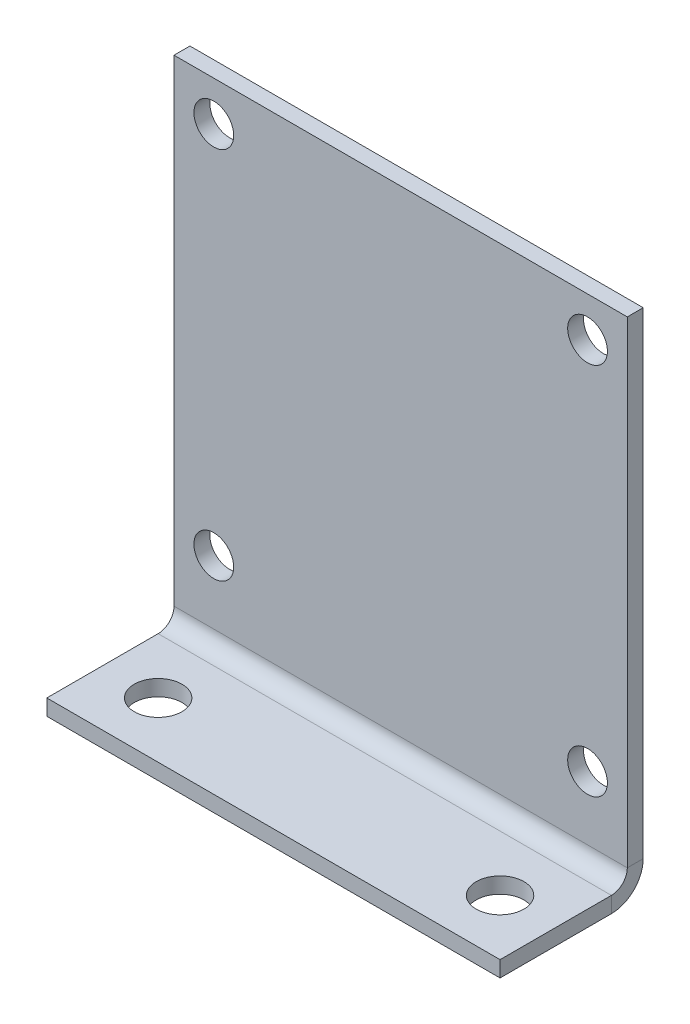
ISO-10303-21;
HEADER;
FILE_DESCRIPTION(('STEP AP214'),'2;1');
FILE_NAME('part.step','',(''),(''),'','','');
FILE_SCHEMA(('AUTOMOTIVE_DESIGN { 1 0 10303 214 1 1 1 1 }'));
ENDSEC;
DATA;
#1=APPLICATION_CONTEXT('core data for automotive mechanical design processes');
#2=APPLICATION_PROTOCOL_DEFINITION('international standard','automotive_design',2000,#1);
#3=PRODUCT_CONTEXT('',#1,'mechanical');
#4=PRODUCT('Part','Part','',(#3));
#5=PRODUCT_RELATED_PRODUCT_CATEGORY('part','',(#4));
#6=PRODUCT_DEFINITION_FORMATION('','',#4);
#7=PRODUCT_DEFINITION_CONTEXT('part definition',#1,'design');
#8=PRODUCT_DEFINITION('design','',#6,#7);
#9=PRODUCT_DEFINITION_SHAPE('','',#8);
#10=(LENGTH_UNIT() NAMED_UNIT(*) SI_UNIT(.MILLI.,.METRE.));
#11=(NAMED_UNIT(*) PLANE_ANGLE_UNIT() SI_UNIT($,.RADIAN.));
#12=(NAMED_UNIT(*) SI_UNIT($,.STERADIAN.) SOLID_ANGLE_UNIT());
#13=UNCERTAINTY_MEASURE_WITH_UNIT(LENGTH_MEASURE(1.E-05),#10,'distance_accuracy_value','');
#14=(GEOMETRIC_REPRESENTATION_CONTEXT(3) GLOBAL_UNCERTAINTY_ASSIGNED_CONTEXT((#13)) GLOBAL_UNIT_ASSIGNED_CONTEXT((#10,
#11,#12)) REPRESENTATION_CONTEXT('',''));
#15=CARTESIAN_POINT('',(0.,0.,0.));
#16=DIRECTION('',(0.,0.,1.));
#17=DIRECTION('',(1.,0.,0.));
#18=AXIS2_PLACEMENT_3D('',#15,#16,#17);
#19=CARTESIAN_POINT('',(50.,2.,11.));
#20=DIRECTION('',(0.,-1.,0.));
#21=DIRECTION('',(-1.,0.,0.));
#22=AXIS2_PLACEMENT_3D('',#19,#20,#21);
#23=CYLINDRICAL_SURFACE('',#22,3.);
#24=CARTESIAN_POINT('',(50.,2.,11.));
#25=DIRECTION('',(0.,-1.,0.));
#26=DIRECTION('',(-1.,0.,0.));
#27=AXIS2_PLACEMENT_3D('',#24,#25,#26);
#28=CIRCLE('',#27,3.);
#29=CARTESIAN_POINT('',(53.,2.,11.));
#30=VERTEX_POINT('',#29);
#31=EDGE_CURVE('E41',#30,#30,#28,.T.);
#32=ORIENTED_EDGE('',*,*,#31,.F.);
#33=DIRECTION('',(0.,-1.,0.));
#34=VECTOR('',#33,1.);
#35=CARTESIAN_POINT('',(53.,2.,11.));
#36=LINE('',#35,#34);
#37=CARTESIAN_POINT('',(53.,0.,11.));
#38=VERTEX_POINT('',#37);
#39=EDGE_CURVE('E11',#30,#38,#36,.T.);
#40=ORIENTED_EDGE('',*,*,#39,.T.);
#41=CARTESIAN_POINT('',(50.,0.,11.));
#42=DIRECTION('',(0.,1.,0.));
#43=DIRECTION('',(-1.,0.,0.));
#44=AXIS2_PLACEMENT_3D('',#41,#42,#43);
#45=CIRCLE('',#44,3.);
#46=EDGE_CURVE('E209',#38,#38,#45,.T.);
#47=ORIENTED_EDGE('',*,*,#46,.F.);
#48=ORIENTED_EDGE('',*,*,#39,.F.);
#49=EDGE_LOOP('',(#32,#40,#47,#48));
#50=FACE_BOUND('',#49,.T.);
#51=ADVANCED_FACE('F17',(#50),#23,.F.);
#52=CARTESIAN_POINT('',(7.,2.,11.));
#53=DIRECTION('',(0.,-1.,0.));
#54=DIRECTION('',(-1.,0.,0.));
#55=AXIS2_PLACEMENT_3D('',#52,#53,#54);
#56=CYLINDRICAL_SURFACE('',#55,3.);
#57=CARTESIAN_POINT('',(7.,2.,11.));
#58=DIRECTION('',(0.,-1.,0.));
#59=DIRECTION('',(-1.,0.,0.));
#60=AXIS2_PLACEMENT_3D('',#57,#58,#59);
#61=CIRCLE('',#60,3.);
#62=CARTESIAN_POINT('',(10.,2.,11.));
#63=VERTEX_POINT('',#62);
#64=EDGE_CURVE('E274',#63,#63,#61,.T.);
#65=ORIENTED_EDGE('',*,*,#64,.F.);
#66=DIRECTION('',(0.,-1.,0.));
#67=VECTOR('',#66,1.);
#68=CARTESIAN_POINT('',(10.,2.,11.));
#69=LINE('',#68,#67);
#70=CARTESIAN_POINT('',(10.,0.,11.));
#71=VERTEX_POINT('',#70);
#72=EDGE_CURVE('E28',#63,#71,#69,.T.);
#73=ORIENTED_EDGE('',*,*,#72,.T.);
#74=CARTESIAN_POINT('',(7.,0.,11.));
#75=DIRECTION('',(0.,1.,0.));
#76=DIRECTION('',(-1.,0.,0.));
#77=AXIS2_PLACEMENT_3D('',#74,#75,#76);
#78=CIRCLE('',#77,3.);
#79=EDGE_CURVE('E214',#71,#71,#78,.T.);
#80=ORIENTED_EDGE('',*,*,#79,.F.);
#81=ORIENTED_EDGE('',*,*,#72,.F.);
#82=EDGE_LOOP('',(#65,#73,#80,#81));
#83=FACE_BOUND('',#82,.T.);
#84=ADVANCED_FACE('F382',(#83),#56,.F.);
#85=CARTESIAN_POINT('',(5.,12.,0.));
#86=DIRECTION('',(0.,0.,1.));
#87=DIRECTION('',(1.,0.,0.));
#88=AXIS2_PLACEMENT_3D('',#85,#86,#87);
#89=CYLINDRICAL_SURFACE('',#88,2.5);
#90=CARTESIAN_POINT('',(5.,12.,0.));
#91=DIRECTION('',(0.,0.,1.));
#92=DIRECTION('',(1.,0.,0.));
#93=AXIS2_PLACEMENT_3D('',#90,#91,#92);
#94=CIRCLE('',#93,2.5);
#95=CARTESIAN_POINT('',(2.5,12.,0.));
#96=VERTEX_POINT('',#95);
#97=EDGE_CURVE('E143',#96,#96,#94,.T.);
#98=ORIENTED_EDGE('',*,*,#97,.F.);
#99=DIRECTION('',(0.,0.,1.));
#100=VECTOR('',#99,1.);
#101=CARTESIAN_POINT('',(2.5,12.,0.));
#102=LINE('',#101,#100);
#103=CARTESIAN_POINT('',(2.5,12.,2.));
#104=VERTEX_POINT('',#103);
#105=EDGE_CURVE('E151',#96,#104,#102,.T.);
#106=ORIENTED_EDGE('',*,*,#105,.T.);
#107=CARTESIAN_POINT('',(5.,12.,2.));
#108=DIRECTION('',(0.,0.,-1.));
#109=DIRECTION('',(1.,0.,0.));
#110=AXIS2_PLACEMENT_3D('',#107,#108,#109);
#111=CIRCLE('',#110,2.5);
#112=EDGE_CURVE('E150',#104,#104,#111,.T.);
#113=ORIENTED_EDGE('',*,*,#112,.F.);
#114=ORIENTED_EDGE('',*,*,#105,.F.);
#115=EDGE_LOOP('',(#98,#106,#113,#114));
#116=FACE_BOUND('',#115,.T.);
#117=ADVANCED_FACE('F19',(#116),#89,.F.);
#118=CARTESIAN_POINT('',(5.,59.,0.));
#119=DIRECTION('',(0.,0.,1.));
#120=DIRECTION('',(1.,0.,0.));
#121=AXIS2_PLACEMENT_3D('',#118,#119,#120);
#122=CYLINDRICAL_SURFACE('',#121,2.5);
#123=CARTESIAN_POINT('',(5.,59.,0.));
#124=DIRECTION('',(0.,0.,1.));
#125=DIRECTION('',(1.,0.,0.));
#126=AXIS2_PLACEMENT_3D('',#123,#124,#125);
#127=CIRCLE('',#126,2.5);
#128=CARTESIAN_POINT('',(2.5,59.,0.));
#129=VERTEX_POINT('',#128);
#130=EDGE_CURVE('E229',#129,#129,#127,.T.);
#131=ORIENTED_EDGE('',*,*,#130,.F.);
#132=DIRECTION('',(0.,0.,1.));
#133=VECTOR('',#132,1.);
#134=CARTESIAN_POINT('',(2.5,59.,0.));
#135=LINE('',#134,#133);
#136=CARTESIAN_POINT('',(2.5,59.,2.));
#137=VERTEX_POINT('',#136);
#138=EDGE_CURVE('E179',#129,#137,#135,.T.);
#139=ORIENTED_EDGE('',*,*,#138,.T.);
#140=CARTESIAN_POINT('',(5.,59.,2.));
#141=DIRECTION('',(0.,0.,-1.));
#142=DIRECTION('',(1.,0.,0.));
#143=AXIS2_PLACEMENT_3D('',#140,#141,#142);
#144=CIRCLE('',#143,2.5);
#145=EDGE_CURVE('E154',#137,#137,#144,.T.);
#146=ORIENTED_EDGE('',*,*,#145,.F.);
#147=ORIENTED_EDGE('',*,*,#138,.F.);
#148=EDGE_LOOP('',(#131,#139,#146,#147));
#149=FACE_BOUND('',#148,.T.);
#150=ADVANCED_FACE('F357',(#149),#122,.F.);
#151=CARTESIAN_POINT('',(52.,59.,0.));
#152=DIRECTION('',(0.,0.,1.));
#153=DIRECTION('',(1.,0.,0.));
#154=AXIS2_PLACEMENT_3D('',#151,#152,#153);
#155=CYLINDRICAL_SURFACE('',#154,2.5);
#156=CARTESIAN_POINT('',(52.,59.,0.));
#157=DIRECTION('',(0.,0.,1.));
#158=DIRECTION('',(1.,0.,0.));
#159=AXIS2_PLACEMENT_3D('',#156,#157,#158);
#160=CIRCLE('',#159,2.5);
#161=CARTESIAN_POINT('',(49.5,59.,0.));
#162=VERTEX_POINT('',#161);
#163=EDGE_CURVE('E189',#162,#162,#160,.T.);
#164=ORIENTED_EDGE('',*,*,#163,.F.);
#165=DIRECTION('',(0.,0.,1.));
#166=VECTOR('',#165,1.);
#167=CARTESIAN_POINT('',(49.5,59.,0.));
#168=LINE('',#167,#166);
#169=CARTESIAN_POINT('',(49.5,59.,2.));
#170=VERTEX_POINT('',#169);
#171=EDGE_CURVE('E175',#162,#170,#168,.T.);
#172=ORIENTED_EDGE('',*,*,#171,.T.);
#173=CARTESIAN_POINT('',(52.,59.,2.));
#174=DIRECTION('',(0.,0.,-1.));
#175=DIRECTION('',(1.,0.,0.));
#176=AXIS2_PLACEMENT_3D('',#173,#174,#175);
#177=CIRCLE('',#176,2.5);
#178=EDGE_CURVE('E164',#170,#170,#177,.T.);
#179=ORIENTED_EDGE('',*,*,#178,.F.);
#180=ORIENTED_EDGE('',*,*,#171,.F.);
#181=EDGE_LOOP('',(#164,#172,#179,#180));
#182=FACE_BOUND('',#181,.T.);
#183=ADVANCED_FACE('F393',(#182),#155,.F.);
#184=CARTESIAN_POINT('',(52.,12.,0.));
#185=DIRECTION('',(0.,0.,1.));
#186=DIRECTION('',(1.,0.,0.));
#187=AXIS2_PLACEMENT_3D('',#184,#185,#186);
#188=CYLINDRICAL_SURFACE('',#187,2.5);
#189=CARTESIAN_POINT('',(52.,12.,0.));
#190=DIRECTION('',(0.,0.,1.));
#191=DIRECTION('',(1.,0.,0.));
#192=AXIS2_PLACEMENT_3D('',#189,#190,#191);
#193=CIRCLE('',#192,2.5);
#194=CARTESIAN_POINT('',(49.5,12.,0.));
#195=VERTEX_POINT('',#194);
#196=EDGE_CURVE('E185',#195,#195,#193,.T.);
#197=ORIENTED_EDGE('',*,*,#196,.F.);
#198=DIRECTION('',(0.,0.,1.));
#199=VECTOR('',#198,1.);
#200=CARTESIAN_POINT('',(49.5,12.,0.));
#201=LINE('',#200,#199);
#202=CARTESIAN_POINT('',(49.5,12.,2.));
#203=VERTEX_POINT('',#202);
#204=EDGE_CURVE('E180',#195,#203,#201,.T.);
#205=ORIENTED_EDGE('',*,*,#204,.T.);
#206=CARTESIAN_POINT('',(52.,12.,2.));
#207=DIRECTION('',(0.,0.,-1.));
#208=DIRECTION('',(1.,0.,0.));
#209=AXIS2_PLACEMENT_3D('',#206,#207,#208);
#210=CIRCLE('',#209,2.5);
#211=EDGE_CURVE('E184',#203,#203,#210,.T.);
#212=ORIENTED_EDGE('',*,*,#211,.F.);
#213=ORIENTED_EDGE('',*,*,#204,.F.);
#214=EDGE_LOOP('',(#197,#205,#212,#213));
#215=FACE_BOUND('',#214,.T.);
#216=ADVANCED_FACE('F367',(#215),#188,.F.);
#217=CARTESIAN_POINT('',(28.5,4.,4.));
#218=DIRECTION('',(-1.,0.,0.));
#219=DIRECTION('',(0.,0.,-1.));
#220=AXIS2_PLACEMENT_3D('',#217,#218,#219);
#221=CYLINDRICAL_SURFACE('',#220,4.);
#222=DIRECTION('',(1.,0.,0.));
#223=VECTOR('',#222,1.);
#224=CARTESIAN_POINT('',(28.5,0.,4.));
#225=LINE('',#224,#223);
#226=CARTESIAN_POINT('',(0.,0.,4.));
#227=VERTEX_POINT('',#226);
#228=CARTESIAN_POINT('',(57.,0.,4.));
#229=VERTEX_POINT('',#228);
#230=EDGE_CURVE('E213',#227,#229,#225,.T.);
#231=ORIENTED_EDGE('',*,*,#230,.F.);
#232=CARTESIAN_POINT('',(0.,4.,4.));
#233=DIRECTION('',(-1.,0.,0.));
#234=DIRECTION('',(0.,0.,-1.));
#235=AXIS2_PLACEMENT_3D('',#232,#233,#234);
#236=CIRCLE('',#235,4.);
#237=CARTESIAN_POINT('',(0.,4.,0.));
#238=VERTEX_POINT('',#237);
#239=EDGE_CURVE('E253',#238,#227,#236,.T.);
#240=ORIENTED_EDGE('',*,*,#239,.F.);
#241=DIRECTION('',(-1.,0.,0.));
#242=VECTOR('',#241,1.);
#243=CARTESIAN_POINT('',(42.75,4.,0.));
#244=LINE('',#243,#242);
#245=CARTESIAN_POINT('',(57.,4.,0.));
#246=VERTEX_POINT('',#245);
#247=EDGE_CURVE('E218',#246,#238,#244,.T.);
#248=ORIENTED_EDGE('',*,*,#247,.F.);
#249=CARTESIAN_POINT('',(57.,4.,4.));
#250=DIRECTION('',(1.,0.,0.));
#251=DIRECTION('',(0.,-1.,0.));
#252=AXIS2_PLACEMENT_3D('',#249,#250,#251);
#253=CIRCLE('',#252,4.);
#254=EDGE_CURVE('E236',#229,#246,#253,.T.);
#255=ORIENTED_EDGE('',*,*,#254,.F.);
#256=EDGE_LOOP('',(#231,#240,#248,#255));
#257=FACE_BOUND('',#256,.T.);
#258=ADVANCED_FACE('F392',(#257),#221,.T.);
#259=CARTESIAN_POINT('',(57.,2.,4.));
#260=DIRECTION('',(1.,0.,0.));
#261=DIRECTION('',(0.,1.,0.));
#262=AXIS2_PLACEMENT_3D('',#259,#260,#261);
#263=PLANE('',#262);
#264=DIRECTION('',(0.,1.,0.));
#265=VECTOR('',#264,1.);
#266=CARTESIAN_POINT('',(57.,1.56,4.));
#267=LINE('',#266,#265);
#268=CARTESIAN_POINT('',(57.,2.,4.));
#269=VERTEX_POINT('',#268);
#270=EDGE_CURVE('E205',#229,#269,#267,.T.);
#271=ORIENTED_EDGE('',*,*,#270,.T.);
#272=DIRECTION('',(0.,0.,1.));
#273=VECTOR('',#272,1.);
#274=CARTESIAN_POINT('',(57.,2.,-0.523893421169303));
#275=LINE('',#274,#273);
#276=CARTESIAN_POINT('',(57.,2.,18.));
#277=VERTEX_POINT('',#276);
#278=EDGE_CURVE('E172',#269,#277,#275,.T.);
#279=ORIENTED_EDGE('',*,*,#278,.T.);
#280=DIRECTION('',(0.,-1.,0.));
#281=VECTOR('',#280,1.);
#282=CARTESIAN_POINT('',(57.,2.,18.));
#283=LINE('',#282,#281);
#284=CARTESIAN_POINT('',(57.,0.,18.));
#285=VERTEX_POINT('',#284);
#286=EDGE_CURVE('E170',#277,#285,#283,.T.);
#287=ORIENTED_EDGE('',*,*,#286,.T.);
#288=DIRECTION('',(0.,0.,-1.));
#289=VECTOR('',#288,1.);
#290=CARTESIAN_POINT('',(57.,0.,-0.523893421169303));
#291=LINE('',#290,#289);
#292=EDGE_CURVE('E173',#285,#229,#291,.T.);
#293=ORIENTED_EDGE('',*,*,#292,.T.);
#294=EDGE_LOOP('',(#271,#279,#287,#293));
#295=FACE_BOUND('',#294,.T.);
#296=ADVANCED_FACE('F389',(#295),#263,.T.);
#297=CARTESIAN_POINT('',(28.5,2.,8.73805328941535));
#298=DIRECTION('',(0.,1.,0.));
#299=DIRECTION('',(1.,0.,0.));
#300=AXIS2_PLACEMENT_3D('',#297,#298,#299);
#301=PLANE('',#300);
#302=DIRECTION('',(-1.,0.,0.));
#303=VECTOR('',#302,1.);
#304=CARTESIAN_POINT('',(28.5,2.,4.));
#305=LINE('',#304,#303);
#306=CARTESIAN_POINT('',(0.,2.,4.));
#307=VERTEX_POINT('',#306);
#308=EDGE_CURVE('E197',#269,#307,#305,.T.);
#309=ORIENTED_EDGE('',*,*,#308,.T.);
#310=DIRECTION('',(0.,0.,1.));
#311=VECTOR('',#310,1.);
#312=CARTESIAN_POINT('',(0.,2.,-0.523893421169303));
#313=LINE('',#312,#311);
#314=CARTESIAN_POINT('',(0.,2.,18.));
#315=VERTEX_POINT('',#314);
#316=EDGE_CURVE('E198',#307,#315,#313,.T.);
#317=ORIENTED_EDGE('',*,*,#316,.T.);
#318=DIRECTION('',(1.,0.,0.));
#319=VECTOR('',#318,1.);
#320=CARTESIAN_POINT('',(0.,2.,18.));
#321=LINE('',#320,#319);
#322=EDGE_CURVE('E21',#315,#277,#321,.T.);
#323=ORIENTED_EDGE('',*,*,#322,.T.);
#324=ORIENTED_EDGE('',*,*,#278,.F.);
#325=EDGE_LOOP('',(#309,#317,#323,#324));
#326=FACE_BOUND('',#325,.T.);
#327=ORIENTED_EDGE('',*,*,#31,.T.);
#328=EDGE_LOOP('',(#327));
#329=FACE_BOUND('',#328,.T.);
#330=ORIENTED_EDGE('',*,*,#64,.T.);
#331=EDGE_LOOP('',(#330));
#332=FACE_BOUND('',#331,.T.);
#333=ADVANCED_FACE('F416',(#326,#329,#332),#301,.T.);
#334=CARTESIAN_POINT('',(0.,2.,4.));
#335=DIRECTION('',(-1.,0.,0.));
#336=DIRECTION('',(0.,0.,1.));
#337=AXIS2_PLACEMENT_3D('',#334,#335,#336);
#338=PLANE('',#337);
#339=DIRECTION('',(0.,-1.,0.));
#340=VECTOR('',#339,1.);
#341=CARTESIAN_POINT('',(0.,1.56,4.));
#342=LINE('',#341,#340);
#343=EDGE_CURVE('E237',#307,#227,#342,.T.);
#344=ORIENTED_EDGE('',*,*,#343,.F.);
#345=CARTESIAN_POINT('',(0.,4.,4.));
#346=DIRECTION('',(-1.,0.,0.));
#347=DIRECTION('',(0.,0.,-1.));
#348=AXIS2_PLACEMENT_3D('',#345,#346,#347);
#349=CIRCLE('',#348,2.);
#350=CARTESIAN_POINT('',(0.,4.,2.));
#351=VERTEX_POINT('',#350);
#352=EDGE_CURVE('E168',#351,#307,#349,.T.);
#353=ORIENTED_EDGE('',*,*,#352,.F.);
#354=DIRECTION('',(0.,0.,1.));
#355=VECTOR('',#354,1.);
#356=CARTESIAN_POINT('',(0.,4.,1.));
#357=LINE('',#356,#355);
#358=EDGE_CURVE('E190',#238,#351,#357,.T.);
#359=ORIENTED_EDGE('',*,*,#358,.F.);
#360=ORIENTED_EDGE('',*,*,#239,.T.);
#361=EDGE_LOOP('',(#344,#353,#359,#360));
#362=FACE_BOUND('',#361,.T.);
#363=ADVANCED_FACE('F327',(#362),#338,.T.);
#364=CARTESIAN_POINT('',(57.,0.,4.));
#365=DIRECTION('',(1.,0.,0.));
#366=DIRECTION('',(0.,1.,0.));
#367=AXIS2_PLACEMENT_3D('',#364,#365,#366);
#368=PLANE('',#367);
#369=ORIENTED_EDGE('',*,*,#270,.F.);
#370=ORIENTED_EDGE('',*,*,#254,.T.);
#371=DIRECTION('',(0.,0.,-1.));
#372=VECTOR('',#371,1.);
#373=CARTESIAN_POINT('',(57.,4.,1.));
#374=LINE('',#373,#372);
#375=CARTESIAN_POINT('',(57.,4.,2.));
#376=VERTEX_POINT('',#375);
#377=EDGE_CURVE('E293',#376,#246,#374,.T.);
#378=ORIENTED_EDGE('',*,*,#377,.F.);
#379=CARTESIAN_POINT('',(57.,4.,4.));
#380=DIRECTION('',(-1.,0.,0.));
#381=DIRECTION('',(0.,0.,-1.));
#382=AXIS2_PLACEMENT_3D('',#379,#380,#381);
#383=CIRCLE('',#382,2.);
#384=EDGE_CURVE('E233',#376,#269,#383,.T.);
#385=ORIENTED_EDGE('',*,*,#384,.T.);
#386=EDGE_LOOP('',(#369,#370,#378,#385));
#387=FACE_BOUND('',#386,.T.);
#388=ADVANCED_FACE('F397',(#387),#368,.T.);
#389=CARTESIAN_POINT('',(0.,2.,4.));
#390=DIRECTION('',(-1.,0.,0.));
#391=DIRECTION('',(0.,0.,1.));
#392=AXIS2_PLACEMENT_3D('',#389,#390,#391);
#393=PLANE('',#392);
#394=ORIENTED_EDGE('',*,*,#343,.T.);
#395=DIRECTION('',(0.,0.,1.));
#396=VECTOR('',#395,1.);
#397=CARTESIAN_POINT('',(0.,0.,4.));
#398=LINE('',#397,#396);
#399=CARTESIAN_POINT('',(0.,0.,18.));
#400=VERTEX_POINT('',#399);
#401=EDGE_CURVE('E242',#227,#400,#398,.T.);
#402=ORIENTED_EDGE('',*,*,#401,.T.);
#403=DIRECTION('',(0.,-1.,0.));
#404=VECTOR('',#403,1.);
#405=CARTESIAN_POINT('',(0.,2.,18.));
#406=LINE('',#405,#404);
#407=EDGE_CURVE('E279',#315,#400,#406,.T.);
#408=ORIENTED_EDGE('',*,*,#407,.F.);
#409=ORIENTED_EDGE('',*,*,#316,.F.);
#410=EDGE_LOOP('',(#394,#402,#408,#409));
#411=FACE_BOUND('',#410,.T.);
#412=ADVANCED_FACE('F400',(#411),#393,.T.);
#413=CARTESIAN_POINT('',(0.,2.,18.));
#414=DIRECTION('',(0.,0.,1.));
#415=DIRECTION('',(1.,0.,0.));
#416=AXIS2_PLACEMENT_3D('',#413,#414,#415);
#417=PLANE('',#416);
#418=DIRECTION('',(1.,0.,0.));
#419=VECTOR('',#418,1.);
#420=CARTESIAN_POINT('',(0.,0.,18.));
#421=LINE('',#420,#419);
#422=EDGE_CURVE('E297',#400,#285,#421,.T.);
#423=ORIENTED_EDGE('',*,*,#422,.T.);
#424=ORIENTED_EDGE('',*,*,#286,.F.);
#425=ORIENTED_EDGE('',*,*,#322,.F.);
#426=ORIENTED_EDGE('',*,*,#407,.T.);
#427=EDGE_LOOP('',(#423,#424,#425,#426));
#428=FACE_BOUND('',#427,.T.);
#429=ADVANCED_FACE('F404',(#428),#417,.T.);
#430=CARTESIAN_POINT('',(28.5,0.,8.73805328941535));
#431=DIRECTION('',(0.,1.,0.));
#432=DIRECTION('',(1.,0.,0.));
#433=AXIS2_PLACEMENT_3D('',#430,#431,#432);
#434=PLANE('',#433);
#435=ORIENTED_EDGE('',*,*,#230,.T.);
#436=ORIENTED_EDGE('',*,*,#292,.F.);
#437=ORIENTED_EDGE('',*,*,#422,.F.);
#438=ORIENTED_EDGE('',*,*,#401,.F.);
#439=EDGE_LOOP('',(#435,#436,#437,#438));
#440=FACE_BOUND('',#439,.T.);
#441=ORIENTED_EDGE('',*,*,#46,.T.);
#442=EDGE_LOOP('',(#441));
#443=FACE_BOUND('',#442,.T.);
#444=ORIENTED_EDGE('',*,*,#79,.T.);
#445=EDGE_LOOP('',(#444));
#446=FACE_BOUND('',#445,.T.);
#447=ADVANCED_FACE('F402',(#440,#443,#446),#434,.F.);
#448=CARTESIAN_POINT('',(28.5,4.,4.));
#449=DIRECTION('',(-1.,0.,0.));
#450=DIRECTION('',(0.,0.,-1.));
#451=AXIS2_PLACEMENT_3D('',#448,#449,#450);
#452=CYLINDRICAL_SURFACE('',#451,2.);
#453=ORIENTED_EDGE('',*,*,#308,.F.);
#454=ORIENTED_EDGE('',*,*,#384,.F.);
#455=DIRECTION('',(1.,0.,0.));
#456=VECTOR('',#455,1.);
#457=CARTESIAN_POINT('',(42.75,4.,2.));
#458=LINE('',#457,#456);
#459=EDGE_CURVE('E86',#351,#376,#458,.T.);
#460=ORIENTED_EDGE('',*,*,#459,.F.);
#461=ORIENTED_EDGE('',*,*,#352,.T.);
#462=EDGE_LOOP('',(#453,#454,#460,#461));
#463=FACE_BOUND('',#462,.T.);
#464=ADVANCED_FACE('F324',(#463),#452,.F.);
#465=CARTESIAN_POINT('',(57.,64.,0.));
#466=DIRECTION('',(1.,0.,0.));
#467=DIRECTION('',(0.,1.,0.));
#468=AXIS2_PLACEMENT_3D('',#465,#466,#467);
#469=PLANE('',#468);
#470=ORIENTED_EDGE('',*,*,#377,.T.);
#471=DIRECTION('',(0.,1.,0.));
#472=VECTOR('',#471,1.);
#473=CARTESIAN_POINT('',(57.,0.,0.));
#474=LINE('',#473,#472);
#475=CARTESIAN_POINT('',(57.,64.,0.));
#476=VERTEX_POINT('',#475);
#477=EDGE_CURVE('E247',#246,#476,#474,.T.);
#478=ORIENTED_EDGE('',*,*,#477,.T.);
#479=DIRECTION('',(0.,0.,1.));
#480=VECTOR('',#479,1.);
#481=CARTESIAN_POINT('',(57.,64.,0.));
#482=LINE('',#481,#480);
#483=CARTESIAN_POINT('',(57.,64.,2.));
#484=VERTEX_POINT('',#483);
#485=EDGE_CURVE('E243',#476,#484,#482,.T.);
#486=ORIENTED_EDGE('',*,*,#485,.T.);
#487=DIRECTION('',(0.,-1.,0.));
#488=VECTOR('',#487,1.);
#489=CARTESIAN_POINT('',(57.,0.,2.));
#490=LINE('',#489,#488);
#491=EDGE_CURVE('E222',#484,#376,#490,.T.);
#492=ORIENTED_EDGE('',*,*,#491,.T.);
#493=EDGE_LOOP('',(#470,#478,#486,#492));
#494=FACE_BOUND('',#493,.T.);
#495=ADVANCED_FACE('F370',(#494),#469,.T.);
#496=CARTESIAN_POINT('',(28.5,32.,0.));
#497=DIRECTION('',(0.,0.,1.));
#498=DIRECTION('',(1.,0.,0.));
#499=AXIS2_PLACEMENT_3D('',#496,#497,#498);
#500=PLANE('',#499);
#501=ORIENTED_EDGE('',*,*,#247,.T.);
#502=DIRECTION('',(0.,-1.,0.));
#503=VECTOR('',#502,1.);
#504=CARTESIAN_POINT('',(0.,64.,0.));
#505=LINE('',#504,#503);
#506=CARTESIAN_POINT('',(0.,64.,0.));
#507=VERTEX_POINT('',#506);
#508=EDGE_CURVE('E260',#507,#238,#505,.T.);
#509=ORIENTED_EDGE('',*,*,#508,.F.);
#510=DIRECTION('',(-1.,0.,0.));
#511=VECTOR('',#510,1.);
#512=CARTESIAN_POINT('',(57.,64.,0.));
#513=LINE('',#512,#511);
#514=EDGE_CURVE('E263',#476,#507,#513,.T.);
#515=ORIENTED_EDGE('',*,*,#514,.F.);
#516=ORIENTED_EDGE('',*,*,#477,.F.);
#517=EDGE_LOOP('',(#501,#509,#515,#516));
#518=FACE_BOUND('',#517,.T.);
#519=ORIENTED_EDGE('',*,*,#97,.T.);
#520=EDGE_LOOP('',(#519));
#521=FACE_BOUND('',#520,.T.);
#522=ORIENTED_EDGE('',*,*,#130,.T.);
#523=EDGE_LOOP('',(#522));
#524=FACE_BOUND('',#523,.T.);
#525=ORIENTED_EDGE('',*,*,#163,.T.);
#526=EDGE_LOOP('',(#525));
#527=FACE_BOUND('',#526,.T.);
#528=ORIENTED_EDGE('',*,*,#196,.T.);
#529=EDGE_LOOP('',(#528));
#530=FACE_BOUND('',#529,.T.);
#531=ADVANCED_FACE('F337',(#518,#521,#524,#527,#530),#500,.F.);
#532=CARTESIAN_POINT('',(0.,0.,0.));
#533=DIRECTION('',(-1.,0.,0.));
#534=DIRECTION('',(0.,1.,0.));
#535=AXIS2_PLACEMENT_3D('',#532,#533,#534);
#536=PLANE('',#535);
#537=ORIENTED_EDGE('',*,*,#358,.T.);
#538=DIRECTION('',(0.,1.,0.));
#539=VECTOR('',#538,1.);
#540=CARTESIAN_POINT('',(0.,64.,2.));
#541=LINE('',#540,#539);
#542=CARTESIAN_POINT('',(0.,64.,2.));
#543=VERTEX_POINT('',#542);
#544=EDGE_CURVE('E225',#351,#543,#541,.T.);
#545=ORIENTED_EDGE('',*,*,#544,.T.);
#546=DIRECTION('',(0.,0.,1.));
#547=VECTOR('',#546,1.);
#548=CARTESIAN_POINT('',(0.,64.,0.));
#549=LINE('',#548,#547);
#550=EDGE_CURVE('E160',#507,#543,#549,.T.);
#551=ORIENTED_EDGE('',*,*,#550,.F.);
#552=ORIENTED_EDGE('',*,*,#508,.T.);
#553=EDGE_LOOP('',(#537,#545,#551,#552));
#554=FACE_BOUND('',#553,.T.);
#555=ADVANCED_FACE('F333',(#554),#536,.T.);
#556=CARTESIAN_POINT('',(0.,64.,0.));
#557=DIRECTION('',(0.,1.,0.));
#558=DIRECTION('',(1.,0.,0.));
#559=AXIS2_PLACEMENT_3D('',#556,#557,#558);
#560=PLANE('',#559);
#561=DIRECTION('',(1.,0.,0.));
#562=VECTOR('',#561,1.);
#563=CARTESIAN_POINT('',(57.,64.,2.));
#564=LINE('',#563,#562);
#565=EDGE_CURVE('E264',#543,#484,#564,.T.);
#566=ORIENTED_EDGE('',*,*,#565,.T.);
#567=ORIENTED_EDGE('',*,*,#485,.F.);
#568=ORIENTED_EDGE('',*,*,#514,.T.);
#569=ORIENTED_EDGE('',*,*,#550,.T.);
#570=EDGE_LOOP('',(#566,#567,#568,#569));
#571=FACE_BOUND('',#570,.T.);
#572=ADVANCED_FACE('F361',(#571),#560,.T.);
#573=CARTESIAN_POINT('',(28.5,32.,2.));
#574=DIRECTION('',(0.,0.,1.));
#575=DIRECTION('',(1.,0.,0.));
#576=AXIS2_PLACEMENT_3D('',#573,#574,#575);
#577=PLANE('',#576);
#578=ORIENTED_EDGE('',*,*,#459,.T.);
#579=ORIENTED_EDGE('',*,*,#491,.F.);
#580=ORIENTED_EDGE('',*,*,#565,.F.);
#581=ORIENTED_EDGE('',*,*,#544,.F.);
#582=EDGE_LOOP('',(#578,#579,#580,#581));
#583=FACE_BOUND('',#582,.T.);
#584=ORIENTED_EDGE('',*,*,#112,.T.);
#585=EDGE_LOOP('',(#584));
#586=FACE_BOUND('',#585,.T.);
#587=ORIENTED_EDGE('',*,*,#145,.T.);
#588=EDGE_LOOP('',(#587));
#589=FACE_BOUND('',#588,.T.);
#590=ORIENTED_EDGE('',*,*,#178,.T.);
#591=EDGE_LOOP('',(#590));
#592=FACE_BOUND('',#591,.T.);
#593=ORIENTED_EDGE('',*,*,#211,.T.);
#594=EDGE_LOOP('',(#593));
#595=FACE_BOUND('',#594,.T.);
#596=ADVANCED_FACE('F330',(#583,#586,#589,#592,#595),#577,.T.);
#597=CLOSED_SHELL('',(#51,#84,#117,#150,#183,#216,#258,#296,#333,#363,#388,#412,#429,#447,#464,
#495,#531,#555,#572,#596));
#598=MANIFOLD_SOLID_BREP('B1',#597);
#599=ADVANCED_BREP_SHAPE_REPRESENTATION('',(#18,#598),#14);
#600=SHAPE_DEFINITION_REPRESENTATION(#9,#599);
ENDSEC;
END-ISO-10303-21;
